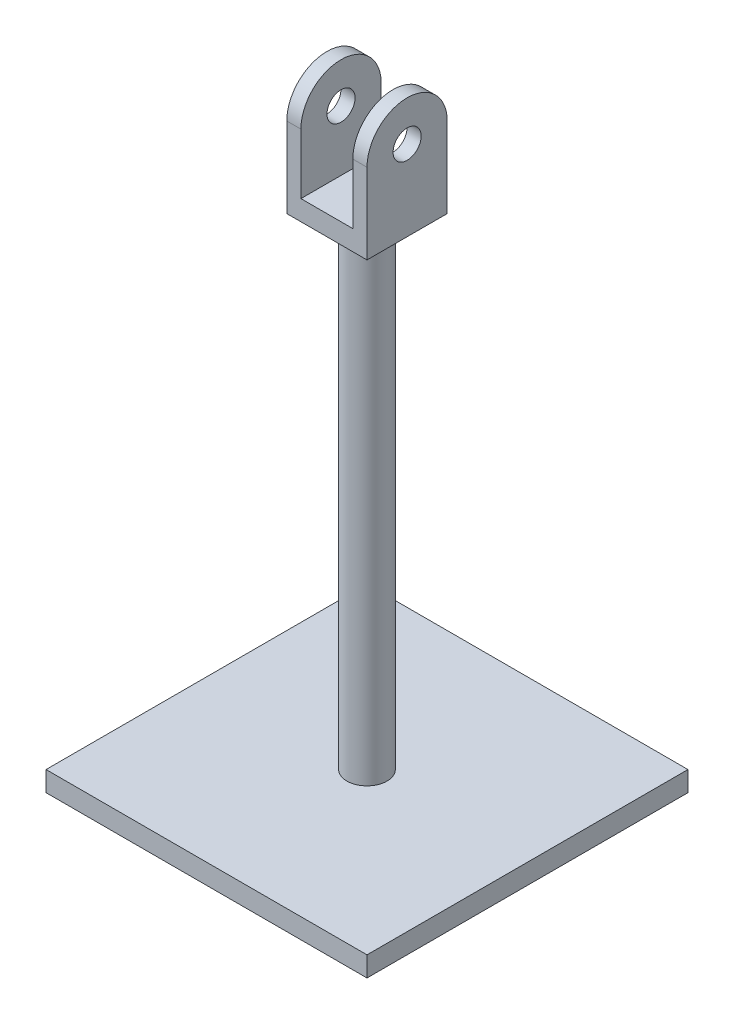
ISO-10303-21;
HEADER;
FILE_DESCRIPTION(('STEP AP214'),'2;1');
FILE_NAME('part.step','',(''),(''),'','','');
FILE_SCHEMA(('AUTOMOTIVE_DESIGN { 1 0 10303 214 1 1 1 1 }'));
ENDSEC;
DATA;
#1=APPLICATION_CONTEXT('core data for automotive mechanical design processes');
#2=APPLICATION_PROTOCOL_DEFINITION('international standard','automotive_design',2000,#1);
#3=PRODUCT_CONTEXT('',#1,'mechanical');
#4=PRODUCT('Part','Part','',(#3));
#5=PRODUCT_RELATED_PRODUCT_CATEGORY('part','',(#4));
#6=PRODUCT_DEFINITION_FORMATION('','',#4);
#7=PRODUCT_DEFINITION_CONTEXT('part definition',#1,'design');
#8=PRODUCT_DEFINITION('design','',#6,#7);
#9=PRODUCT_DEFINITION_SHAPE('','',#8);
#10=(LENGTH_UNIT() NAMED_UNIT(*) SI_UNIT(.MILLI.,.METRE.));
#11=(NAMED_UNIT(*) PLANE_ANGLE_UNIT() SI_UNIT($,.RADIAN.));
#12=(NAMED_UNIT(*) SI_UNIT($,.STERADIAN.) SOLID_ANGLE_UNIT());
#13=UNCERTAINTY_MEASURE_WITH_UNIT(LENGTH_MEASURE(1.E-05),#10,'distance_accuracy_value','');
#14=(GEOMETRIC_REPRESENTATION_CONTEXT(3) GLOBAL_UNCERTAINTY_ASSIGNED_CONTEXT((#13)) GLOBAL_UNIT_ASSIGNED_CONTEXT((#10,
#11,#12)) REPRESENTATION_CONTEXT('',''));
#15=CARTESIAN_POINT('',(0.,0.,0.));
#16=DIRECTION('',(0.,0.,1.));
#17=DIRECTION('',(1.,0.,0.));
#18=AXIS2_PLACEMENT_3D('',#15,#16,#17);
#19=CARTESIAN_POINT('',(10.,145.,0.));
#20=DIRECTION('',(-1.,0.,0.));
#21=DIRECTION('',(0.,0.,1.));
#22=AXIS2_PLACEMENT_3D('',#19,#20,#21);
#23=CYLINDRICAL_SURFACE('',#22,10.);
#24=DIRECTION('',(-1.,0.,0.));
#25=VECTOR('',#24,1.);
#26=CARTESIAN_POINT('',(10.,145.,-10.));
#27=LINE('',#26,#25);
#28=CARTESIAN_POINT('',(10.,145.,-10.));
#29=VERTEX_POINT('',#28);
#30=CARTESIAN_POINT('',(6.47247521819706,145.,-10.));
#31=VERTEX_POINT('',#30);
#32=EDGE_CURVE('E181',#29,#31,#27,.T.);
#33=ORIENTED_EDGE('',*,*,#32,.T.);
#34=CARTESIAN_POINT('',(6.47247521819706,145.,0.));
#35=DIRECTION('',(1.,0.,0.));
#36=DIRECTION('',(0.,0.,-1.));
#37=AXIS2_PLACEMENT_3D('',#34,#35,#36);
#38=CIRCLE('',#37,10.);
#39=CARTESIAN_POINT('',(6.47247521819706,145.,10.));
#40=VERTEX_POINT('',#39);
#41=EDGE_CURVE('E155',#31,#40,#38,.T.);
#42=ORIENTED_EDGE('',*,*,#41,.T.);
#43=DIRECTION('',(-1.,0.,0.));
#44=VECTOR('',#43,1.);
#45=CARTESIAN_POINT('',(10.,145.,10.));
#46=LINE('',#45,#44);
#47=CARTESIAN_POINT('',(10.,145.,10.));
#48=VERTEX_POINT('',#47);
#49=EDGE_CURVE('E178',#48,#40,#46,.T.);
#50=ORIENTED_EDGE('',*,*,#49,.F.);
#51=CARTESIAN_POINT('',(10.,145.,0.));
#52=DIRECTION('',(1.,0.,0.));
#53=DIRECTION('',(0.,0.,-1.));
#54=AXIS2_PLACEMENT_3D('',#51,#52,#53);
#55=CIRCLE('',#54,10.);
#56=EDGE_CURVE('E172',#29,#48,#55,.T.);
#57=ORIENTED_EDGE('',*,*,#56,.F.);
#58=EDGE_LOOP('',(#33,#42,#50,#57));
#59=FACE_BOUND('',#58,.T.);
#60=ADVANCED_FACE('F33',(#59),#23,.T.);
#61=CARTESIAN_POINT('',(10.,145.,0.));
#62=DIRECTION('',(-1.,0.,0.));
#63=DIRECTION('',(0.,0.,1.));
#64=AXIS2_PLACEMENT_3D('',#61,#62,#63);
#65=CYLINDRICAL_SURFACE('',#64,3.5);
#66=CARTESIAN_POINT('',(6.47247521819706,145.,0.));
#67=DIRECTION('',(1.,0.,0.));
#68=DIRECTION('',(0.,0.,-1.));
#69=AXIS2_PLACEMENT_3D('',#66,#67,#68);
#70=CIRCLE('',#69,3.5);
#71=CARTESIAN_POINT('',(6.47247521819706,145.,-3.5));
#72=VERTEX_POINT('',#71);
#73=EDGE_CURVE('E152',#72,#72,#70,.T.);
#74=ORIENTED_EDGE('',*,*,#73,.F.);
#75=EDGE_LOOP('',(#74));
#76=FACE_BOUND('',#75,.T.);
#77=CARTESIAN_POINT('',(10.,145.,0.));
#78=DIRECTION('',(1.,0.,0.));
#79=DIRECTION('',(0.,0.,-1.));
#80=AXIS2_PLACEMENT_3D('',#77,#78,#79);
#81=CIRCLE('',#80,3.5);
#82=CARTESIAN_POINT('',(10.,145.,-3.5));
#83=VERTEX_POINT('',#82);
#84=EDGE_CURVE('E166',#83,#83,#81,.T.);
#85=ORIENTED_EDGE('',*,*,#84,.T.);
#86=EDGE_LOOP('',(#85));
#87=FACE_BOUND('',#86,.T.);
#88=ADVANCED_FACE('F272',(#76,#87),#65,.F.);
#89=CARTESIAN_POINT('',(0.,5.,0.));
#90=DIRECTION('',(0.,1.,0.));
#91=DIRECTION('',(0.,0.,1.));
#92=AXIS2_PLACEMENT_3D('',#89,#90,#91);
#93=PLANE('',#92);
#94=DIRECTION('',(0.,0.,-1.));
#95=VECTOR('',#94,1.);
#96=CARTESIAN_POINT('',(40.,5.,-40.));
#97=LINE('',#96,#95);
#98=CARTESIAN_POINT('',(40.,5.,40.));
#99=VERTEX_POINT('',#98);
#100=CARTESIAN_POINT('',(40.,5.,-40.));
#101=VERTEX_POINT('',#100);
#102=EDGE_CURVE('E212',#99,#101,#97,.T.);
#103=ORIENTED_EDGE('',*,*,#102,.T.);
#104=DIRECTION('',(-1.,0.,0.));
#105=VECTOR('',#104,1.);
#106=CARTESIAN_POINT('',(-40.,5.,-40.));
#107=LINE('',#106,#105);
#108=CARTESIAN_POINT('',(-40.,5.,-40.));
#109=VERTEX_POINT('',#108);
#110=EDGE_CURVE('E86',#101,#109,#107,.T.);
#111=ORIENTED_EDGE('',*,*,#110,.T.);
#112=DIRECTION('',(0.,0.,1.));
#113=VECTOR('',#112,1.);
#114=CARTESIAN_POINT('',(-40.,5.,-40.));
#115=LINE('',#114,#113);
#116=CARTESIAN_POINT('',(-40.,5.,40.));
#117=VERTEX_POINT('',#116);
#118=EDGE_CURVE('E215',#109,#117,#115,.T.);
#119=ORIENTED_EDGE('',*,*,#118,.T.);
#120=DIRECTION('',(1.,0.,0.));
#121=VECTOR('',#120,1.);
#122=CARTESIAN_POINT('',(-40.,5.,40.));
#123=LINE('',#122,#121);
#124=EDGE_CURVE('E57',#117,#99,#123,.T.);
#125=ORIENTED_EDGE('',*,*,#124,.T.);
#126=EDGE_LOOP('',(#103,#111,#119,#125));
#127=FACE_BOUND('',#126,.T.);
#128=CARTESIAN_POINT('',(0.,5.,0.));
#129=DIRECTION('',(0.,1.,0.));
#130=DIRECTION('',(0.,0.,1.));
#131=AXIS2_PLACEMENT_3D('',#128,#129,#130);
#132=CIRCLE('',#131,5.);
#133=CARTESIAN_POINT('',(0.,5.,5.));
#134=VERTEX_POINT('',#133);
#135=EDGE_CURVE('E205',#134,#134,#132,.T.);
#136=ORIENTED_EDGE('',*,*,#135,.F.);
#137=EDGE_LOOP('',(#136));
#138=FACE_BOUND('',#137,.T.);
#139=ADVANCED_FACE('F280',(#127,#138),#93,.T.);
#140=CARTESIAN_POINT('',(40.,5.,-40.));
#141=DIRECTION('',(-1.,0.,0.));
#142=DIRECTION('',(0.,0.,1.));
#143=AXIS2_PLACEMENT_3D('',#140,#141,#142);
#144=PLANE('',#143);
#145=DIRECTION('',(0.,0.,-1.));
#146=VECTOR('',#145,1.);
#147=CARTESIAN_POINT('',(40.,0.,-40.));
#148=LINE('',#147,#146);
#149=CARTESIAN_POINT('',(40.,0.,40.));
#150=VERTEX_POINT('',#149);
#151=CARTESIAN_POINT('',(40.,0.,-40.));
#152=VERTEX_POINT('',#151);
#153=EDGE_CURVE('E209',#150,#152,#148,.T.);
#154=ORIENTED_EDGE('',*,*,#153,.T.);
#155=DIRECTION('',(0.,-1.,0.));
#156=VECTOR('',#155,1.);
#157=CARTESIAN_POINT('',(40.,5.,-40.));
#158=LINE('',#157,#156);
#159=EDGE_CURVE('E41',#101,#152,#158,.T.);
#160=ORIENTED_EDGE('',*,*,#159,.F.);
#161=ORIENTED_EDGE('',*,*,#102,.F.);
#162=DIRECTION('',(0.,-1.,0.));
#163=VECTOR('',#162,1.);
#164=CARTESIAN_POINT('',(40.,5.,40.));
#165=LINE('',#164,#163);
#166=EDGE_CURVE('E218',#99,#150,#165,.T.);
#167=ORIENTED_EDGE('',*,*,#166,.T.);
#168=EDGE_LOOP('',(#154,#160,#161,#167));
#169=FACE_BOUND('',#168,.T.);
#170=ADVANCED_FACE('F35',(#169),#144,.F.);
#171=CARTESIAN_POINT('',(-40.,5.,-40.));
#172=DIRECTION('',(0.,0.,1.));
#173=DIRECTION('',(1.,0.,0.));
#174=AXIS2_PLACEMENT_3D('',#171,#172,#173);
#175=PLANE('',#174);
#176=DIRECTION('',(-1.,0.,0.));
#177=VECTOR('',#176,1.);
#178=CARTESIAN_POINT('',(-40.,0.,-40.));
#179=LINE('',#178,#177);
#180=CARTESIAN_POINT('',(-40.,0.,-40.));
#181=VERTEX_POINT('',#180);
#182=EDGE_CURVE('E221',#152,#181,#179,.T.);
#183=ORIENTED_EDGE('',*,*,#182,.T.);
#184=DIRECTION('',(0.,-1.,0.));
#185=VECTOR('',#184,1.);
#186=CARTESIAN_POINT('',(-40.,5.,-40.));
#187=LINE('',#186,#185);
#188=EDGE_CURVE('E229',#109,#181,#187,.T.);
#189=ORIENTED_EDGE('',*,*,#188,.F.);
#190=ORIENTED_EDGE('',*,*,#110,.F.);
#191=ORIENTED_EDGE('',*,*,#159,.T.);
#192=EDGE_LOOP('',(#183,#189,#190,#191));
#193=FACE_BOUND('',#192,.T.);
#194=ADVANCED_FACE('F417',(#193),#175,.F.);
#195=CARTESIAN_POINT('',(-40.,5.,-40.));
#196=DIRECTION('',(1.,0.,0.));
#197=DIRECTION('',(0.,0.,-1.));
#198=AXIS2_PLACEMENT_3D('',#195,#196,#197);
#199=PLANE('',#198);
#200=DIRECTION('',(0.,0.,1.));
#201=VECTOR('',#200,1.);
#202=CARTESIAN_POINT('',(-40.,0.,-40.));
#203=LINE('',#202,#201);
#204=CARTESIAN_POINT('',(-40.,0.,40.));
#205=VERTEX_POINT('',#204);
#206=EDGE_CURVE('E223',#181,#205,#203,.T.);
#207=ORIENTED_EDGE('',*,*,#206,.T.);
#208=DIRECTION('',(0.,-1.,0.));
#209=VECTOR('',#208,1.);
#210=CARTESIAN_POINT('',(-40.,5.,40.));
#211=LINE('',#210,#209);
#212=EDGE_CURVE('E227',#117,#205,#211,.T.);
#213=ORIENTED_EDGE('',*,*,#212,.F.);
#214=ORIENTED_EDGE('',*,*,#118,.F.);
#215=ORIENTED_EDGE('',*,*,#188,.T.);
#216=EDGE_LOOP('',(#207,#213,#214,#215));
#217=FACE_BOUND('',#216,.T.);
#218=ADVANCED_FACE('F408',(#217),#199,.F.);
#219=CARTESIAN_POINT('',(-40.,5.,40.));
#220=DIRECTION('',(0.,0.,-1.));
#221=DIRECTION('',(-1.,0.,0.));
#222=AXIS2_PLACEMENT_3D('',#219,#220,#221);
#223=PLANE('',#222);
#224=DIRECTION('',(1.,0.,0.));
#225=VECTOR('',#224,1.);
#226=CARTESIAN_POINT('',(-40.,0.,40.));
#227=LINE('',#226,#225);
#228=EDGE_CURVE('E78',#205,#150,#227,.T.);
#229=ORIENTED_EDGE('',*,*,#228,.T.);
#230=ORIENTED_EDGE('',*,*,#166,.F.);
#231=ORIENTED_EDGE('',*,*,#124,.F.);
#232=ORIENTED_EDGE('',*,*,#212,.T.);
#233=EDGE_LOOP('',(#229,#230,#231,#232));
#234=FACE_BOUND('',#233,.T.);
#235=ADVANCED_FACE('F398',(#234),#223,.F.);
#236=CARTESIAN_POINT('',(0.,0.,0.));
#237=DIRECTION('',(0.,1.,0.));
#238=DIRECTION('',(0.,0.,1.));
#239=AXIS2_PLACEMENT_3D('',#236,#237,#238);
#240=PLANE('',#239);
#241=ORIENTED_EDGE('',*,*,#153,.F.);
#242=ORIENTED_EDGE('',*,*,#228,.F.);
#243=ORIENTED_EDGE('',*,*,#206,.F.);
#244=ORIENTED_EDGE('',*,*,#182,.F.);
#245=EDGE_LOOP('',(#241,#242,#243,#244));
#246=FACE_BOUND('',#245,.T.);
#247=ADVANCED_FACE('F381',(#246),#240,.F.);
#248=CARTESIAN_POINT('',(0.,125.,0.));
#249=DIRECTION('',(0.,-1.,0.));
#250=DIRECTION('',(0.,0.,-1.));
#251=AXIS2_PLACEMENT_3D('',#248,#249,#250);
#252=CYLINDRICAL_SURFACE('',#251,5.);
#253=CARTESIAN_POINT('',(0.,125.,0.));
#254=DIRECTION('',(0.,1.,0.));
#255=DIRECTION('',(0.,0.,1.));
#256=AXIS2_PLACEMENT_3D('',#253,#254,#255);
#257=CIRCLE('',#256,5.);
#258=CARTESIAN_POINT('',(0.,125.,5.));
#259=VERTEX_POINT('',#258);
#260=EDGE_CURVE('E206',#259,#259,#257,.T.);
#261=ORIENTED_EDGE('',*,*,#260,.F.);
#262=EDGE_LOOP('',(#261));
#263=FACE_BOUND('',#262,.T.);
#264=ORIENTED_EDGE('',*,*,#135,.T.);
#265=EDGE_LOOP('',(#264));
#266=FACE_BOUND('',#265,.T.);
#267=ADVANCED_FACE('F373',(#263,#266),#252,.T.);
#268=CARTESIAN_POINT('',(0.,125.,0.));
#269=DIRECTION('',(0.,1.,0.));
#270=DIRECTION('',(0.,0.,1.));
#271=AXIS2_PLACEMENT_3D('',#268,#269,#270);
#272=PLANE('',#271);
#273=DIRECTION('',(0.,0.,-1.));
#274=VECTOR('',#273,1.);
#275=CARTESIAN_POINT('',(10.,125.,-10.));
#276=LINE('',#275,#274);
#277=CARTESIAN_POINT('',(10.,125.,10.));
#278=VERTEX_POINT('',#277);
#279=CARTESIAN_POINT('',(10.,125.,-10.));
#280=VERTEX_POINT('',#279);
#281=EDGE_CURVE('E184',#278,#280,#276,.T.);
#282=ORIENTED_EDGE('',*,*,#281,.F.);
#283=DIRECTION('',(1.,0.,0.));
#284=VECTOR('',#283,1.);
#285=CARTESIAN_POINT('',(-10.,125.,10.));
#286=LINE('',#285,#284);
#287=CARTESIAN_POINT('',(-10.,125.,10.));
#288=VERTEX_POINT('',#287);
#289=EDGE_CURVE('E191',#288,#278,#286,.T.);
#290=ORIENTED_EDGE('',*,*,#289,.F.);
#291=DIRECTION('',(0.,0.,1.));
#292=VECTOR('',#291,1.);
#293=CARTESIAN_POINT('',(-10.,125.,-10.));
#294=LINE('',#293,#292);
#295=CARTESIAN_POINT('',(-10.,125.,-10.));
#296=VERTEX_POINT('',#295);
#297=EDGE_CURVE('E189',#296,#288,#294,.T.);
#298=ORIENTED_EDGE('',*,*,#297,.F.);
#299=DIRECTION('',(-1.,0.,0.));
#300=VECTOR('',#299,1.);
#301=CARTESIAN_POINT('',(-10.,125.,-10.));
#302=LINE('',#301,#300);
#303=EDGE_CURVE('E187',#280,#296,#302,.T.);
#304=ORIENTED_EDGE('',*,*,#303,.F.);
#305=EDGE_LOOP('',(#282,#290,#298,#304));
#306=FACE_BOUND('',#305,.T.);
#307=ORIENTED_EDGE('',*,*,#260,.T.);
#308=EDGE_LOOP('',(#307));
#309=FACE_BOUND('',#308,.T.);
#310=ADVANCED_FACE('F252',(#306,#309),#272,.F.);
#311=CARTESIAN_POINT('',(10.,130.,-10.));
#312=DIRECTION('',(-1.,0.,0.));
#313=DIRECTION('',(0.,0.,1.));
#314=AXIS2_PLACEMENT_3D('',#311,#312,#313);
#315=PLANE('',#314);
#316=ORIENTED_EDGE('',*,*,#281,.T.);
#317=DIRECTION('',(0.,-1.,0.));
#318=VECTOR('',#317,1.);
#319=CARTESIAN_POINT('',(10.,130.,-10.));
#320=LINE('',#319,#318);
#321=EDGE_CURVE('E202',#29,#280,#320,.T.);
#322=ORIENTED_EDGE('',*,*,#321,.F.);
#323=ORIENTED_EDGE('',*,*,#56,.T.);
#324=DIRECTION('',(0.,-1.,0.));
#325=VECTOR('',#324,1.);
#326=CARTESIAN_POINT('',(10.,130.,10.));
#327=LINE('',#326,#325);
#328=EDGE_CURVE('E193',#48,#278,#327,.T.);
#329=ORIENTED_EDGE('',*,*,#328,.T.);
#330=EDGE_LOOP('',(#316,#322,#323,#329));
#331=FACE_BOUND('',#330,.T.);
#332=ORIENTED_EDGE('',*,*,#84,.F.);
#333=EDGE_LOOP('',(#332));
#334=FACE_BOUND('',#333,.T.);
#335=ADVANCED_FACE('F248',(#331,#334),#315,.F.);
#336=CARTESIAN_POINT('',(-10.,130.,-10.));
#337=DIRECTION('',(0.,0.,1.));
#338=DIRECTION('',(1.,0.,0.));
#339=AXIS2_PLACEMENT_3D('',#336,#337,#338);
#340=PLANE('',#339);
#341=DIRECTION('',(1.,0.,0.));
#342=VECTOR('',#341,1.);
#343=CARTESIAN_POINT('',(-10.,130.,-10.));
#344=LINE('',#343,#342);
#345=CARTESIAN_POINT('',(-6.47247521819706,130.,-10.));
#346=VERTEX_POINT('',#345);
#347=CARTESIAN_POINT('',(6.47247521819706,130.,-10.));
#348=VERTEX_POINT('',#347);
#349=EDGE_CURVE('E134',#346,#348,#344,.T.);
#350=ORIENTED_EDGE('',*,*,#349,.T.);
#351=DIRECTION('',(0.,1.,0.));
#352=VECTOR('',#351,1.);
#353=CARTESIAN_POINT('',(6.47247521819706,130.,-10.));
#354=LINE('',#353,#352);
#355=EDGE_CURVE('E142',#348,#31,#354,.T.);
#356=ORIENTED_EDGE('',*,*,#355,.T.);
#357=ORIENTED_EDGE('',*,*,#32,.F.);
#358=ORIENTED_EDGE('',*,*,#321,.T.);
#359=ORIENTED_EDGE('',*,*,#303,.T.);
#360=DIRECTION('',(0.,-1.,0.));
#361=VECTOR('',#360,1.);
#362=CARTESIAN_POINT('',(-10.,130.,-10.));
#363=LINE('',#362,#361);
#364=CARTESIAN_POINT('',(-10.,145.,-10.));
#365=VERTEX_POINT('',#364);
#366=EDGE_CURVE('E199',#365,#296,#363,.T.);
#367=ORIENTED_EDGE('',*,*,#366,.F.);
#368=CARTESIAN_POINT('',(-6.47247521819706,145.,-10.));
#369=VERTEX_POINT('',#368);
#370=EDGE_CURVE('E151',#369,#365,#27,.T.);
#371=ORIENTED_EDGE('',*,*,#370,.F.);
#372=DIRECTION('',(0.,-1.,0.));
#373=VECTOR('',#372,1.);
#374=CARTESIAN_POINT('',(-6.47247521819706,130.,-10.));
#375=LINE('',#374,#373);
#376=EDGE_CURVE('E48',#369,#346,#375,.T.);
#377=ORIENTED_EDGE('',*,*,#376,.T.);
#378=EDGE_LOOP('',(#350,#356,#357,#358,#359,#367,#371,#377));
#379=FACE_BOUND('',#378,.T.);
#380=ADVANCED_FACE('F149',(#379),#340,.F.);
#381=CARTESIAN_POINT('',(-10.,130.,-10.));
#382=DIRECTION('',(1.,0.,0.));
#383=DIRECTION('',(0.,0.,-1.));
#384=AXIS2_PLACEMENT_3D('',#381,#382,#383);
#385=PLANE('',#384);
#386=ORIENTED_EDGE('',*,*,#297,.T.);
#387=DIRECTION('',(0.,-1.,0.));
#388=VECTOR('',#387,1.);
#389=CARTESIAN_POINT('',(-10.,130.,10.));
#390=LINE('',#389,#388);
#391=CARTESIAN_POINT('',(-10.,145.,10.));
#392=VERTEX_POINT('',#391);
#393=EDGE_CURVE('E196',#392,#288,#390,.T.);
#394=ORIENTED_EDGE('',*,*,#393,.F.);
#395=CARTESIAN_POINT('',(-10.,145.,0.));
#396=DIRECTION('',(1.,0.,0.));
#397=DIRECTION('',(0.,0.,-1.));
#398=AXIS2_PLACEMENT_3D('',#395,#396,#397);
#399=CIRCLE('',#398,10.);
#400=EDGE_CURVE('E169',#365,#392,#399,.T.);
#401=ORIENTED_EDGE('',*,*,#400,.F.);
#402=ORIENTED_EDGE('',*,*,#366,.T.);
#403=EDGE_LOOP('',(#386,#394,#401,#402));
#404=FACE_BOUND('',#403,.T.);
#405=CARTESIAN_POINT('',(-10.,145.,0.));
#406=DIRECTION('',(1.,0.,0.));
#407=DIRECTION('',(0.,0.,-1.));
#408=AXIS2_PLACEMENT_3D('',#405,#406,#407);
#409=CIRCLE('',#408,3.5);
#410=CARTESIAN_POINT('',(-10.,145.,-3.5));
#411=VERTEX_POINT('',#410);
#412=EDGE_CURVE('E141',#411,#411,#409,.T.);
#413=ORIENTED_EDGE('',*,*,#412,.T.);
#414=EDGE_LOOP('',(#413));
#415=FACE_BOUND('',#414,.T.);
#416=ADVANCED_FACE('F257',(#404,#415),#385,.F.);
#417=CARTESIAN_POINT('',(-10.,130.,10.));
#418=DIRECTION('',(0.,0.,-1.));
#419=DIRECTION('',(-1.,0.,0.));
#420=AXIS2_PLACEMENT_3D('',#417,#418,#419);
#421=PLANE('',#420);
#422=ORIENTED_EDGE('',*,*,#49,.T.);
#423=DIRECTION('',(0.,-1.,0.));
#424=VECTOR('',#423,1.);
#425=CARTESIAN_POINT('',(6.47247521819707,130.,10.));
#426=LINE('',#425,#424);
#427=CARTESIAN_POINT('',(6.47247521819706,130.,9.99999999999999));
#428=VERTEX_POINT('',#427);
#429=EDGE_CURVE('E162',#40,#428,#426,.T.);
#430=ORIENTED_EDGE('',*,*,#429,.T.);
#431=DIRECTION('',(-1.,0.,0.));
#432=VECTOR('',#431,1.);
#433=CARTESIAN_POINT('',(-10.,130.,10.));
#434=LINE('',#433,#432);
#435=CARTESIAN_POINT('',(-6.47247521819706,130.,9.99999999999999));
#436=VERTEX_POINT('',#435);
#437=EDGE_CURVE('E11',#428,#436,#434,.T.);
#438=ORIENTED_EDGE('',*,*,#437,.T.);
#439=DIRECTION('',(0.,1.,0.));
#440=VECTOR('',#439,1.);
#441=CARTESIAN_POINT('',(-6.47247521819706,130.,10.));
#442=LINE('',#441,#440);
#443=CARTESIAN_POINT('',(-6.47247521819706,145.,10.));
#444=VERTEX_POINT('',#443);
#445=EDGE_CURVE('E146',#436,#444,#442,.T.);
#446=ORIENTED_EDGE('',*,*,#445,.T.);
#447=EDGE_CURVE('E175',#444,#392,#46,.T.);
#448=ORIENTED_EDGE('',*,*,#447,.T.);
#449=ORIENTED_EDGE('',*,*,#393,.T.);
#450=ORIENTED_EDGE('',*,*,#289,.T.);
#451=ORIENTED_EDGE('',*,*,#328,.F.);
#452=EDGE_LOOP('',(#422,#430,#438,#446,#448,#449,#450,#451));
#453=FACE_BOUND('',#452,.T.);
#454=ADVANCED_FACE('F241',(#453),#421,.F.);
#455=ORIENTED_EDGE('',*,*,#447,.F.);
#456=CARTESIAN_POINT('',(-6.47247521819706,145.,0.));
#457=DIRECTION('',(-1.,0.,0.));
#458=DIRECTION('',(0.,0.,1.));
#459=AXIS2_PLACEMENT_3D('',#456,#457,#458);
#460=CIRCLE('',#459,10.);
#461=EDGE_CURVE('E156',#444,#369,#460,.T.);
#462=ORIENTED_EDGE('',*,*,#461,.T.);
#463=ORIENTED_EDGE('',*,*,#370,.T.);
#464=ORIENTED_EDGE('',*,*,#400,.T.);
#465=EDGE_LOOP('',(#455,#462,#463,#464));
#466=FACE_BOUND('',#465,.T.);
#467=ADVANCED_FACE('F262',(#466),#23,.T.);
#468=CARTESIAN_POINT('',(-6.47247521819706,145.,0.));
#469=DIRECTION('',(-1.,0.,0.));
#470=DIRECTION('',(0.,0.,1.));
#471=AXIS2_PLACEMENT_3D('',#468,#469,#470);
#472=CIRCLE('',#471,3.5);
#473=CARTESIAN_POINT('',(-6.47247521819706,145.,3.5));
#474=VERTEX_POINT('',#473);
#475=EDGE_CURVE('E233',#474,#474,#472,.T.);
#476=ORIENTED_EDGE('',*,*,#475,.F.);
#477=EDGE_LOOP('',(#476));
#478=FACE_BOUND('',#477,.T.);
#479=ORIENTED_EDGE('',*,*,#412,.F.);
#480=EDGE_LOOP('',(#479));
#481=FACE_BOUND('',#480,.T.);
#482=ADVANCED_FACE('F264',(#478,#481),#65,.F.);
#483=CARTESIAN_POINT('',(-6.47247521819706,130.,-20.));
#484=DIRECTION('',(0.,-1.,0.));
#485=DIRECTION('',(0.,0.,-1.));
#486=AXIS2_PLACEMENT_3D('',#483,#484,#485);
#487=PLANE('',#486);
#488=DIRECTION('',(0.,0.,1.));
#489=VECTOR('',#488,1.);
#490=CARTESIAN_POINT('',(-6.47247521819706,130.,-20.));
#491=LINE('',#490,#489);
#492=EDGE_CURVE('E136',#346,#436,#491,.T.);
#493=ORIENTED_EDGE('',*,*,#492,.T.);
#494=ORIENTED_EDGE('',*,*,#437,.F.);
#495=DIRECTION('',(0.,0.,1.));
#496=VECTOR('',#495,1.);
#497=CARTESIAN_POINT('',(6.47247521819706,130.,-20.));
#498=LINE('',#497,#496);
#499=EDGE_CURVE('E138',#348,#428,#498,.T.);
#500=ORIENTED_EDGE('',*,*,#499,.F.);
#501=ORIENTED_EDGE('',*,*,#349,.F.);
#502=EDGE_LOOP('',(#493,#494,#500,#501));
#503=FACE_BOUND('',#502,.T.);
#504=ADVANCED_FACE('F135',(#503),#487,.F.);
#505=CARTESIAN_POINT('',(6.47247521819706,180.,-20.));
#506=DIRECTION('',(1.,0.,0.));
#507=DIRECTION('',(0.,0.,-1.));
#508=AXIS2_PLACEMENT_3D('',#505,#506,#507);
#509=PLANE('',#508);
#510=ORIENTED_EDGE('',*,*,#73,.T.);
#511=EDGE_LOOP('',(#510));
#512=FACE_BOUND('',#511,.T.);
#513=ORIENTED_EDGE('',*,*,#499,.T.);
#514=ORIENTED_EDGE('',*,*,#429,.F.);
#515=ORIENTED_EDGE('',*,*,#41,.F.);
#516=ORIENTED_EDGE('',*,*,#355,.F.);
#517=EDGE_LOOP('',(#513,#514,#515,#516));
#518=FACE_BOUND('',#517,.T.);
#519=ADVANCED_FACE('F239',(#512,#518),#509,.F.);
#520=CARTESIAN_POINT('',(-6.47247521819706,180.,-20.));
#521=DIRECTION('',(-1.,0.,0.));
#522=DIRECTION('',(0.,0.,1.));
#523=AXIS2_PLACEMENT_3D('',#520,#521,#522);
#524=PLANE('',#523);
#525=ORIENTED_EDGE('',*,*,#475,.T.);
#526=EDGE_LOOP('',(#525));
#527=FACE_BOUND('',#526,.T.);
#528=ORIENTED_EDGE('',*,*,#461,.F.);
#529=ORIENTED_EDGE('',*,*,#445,.F.);
#530=ORIENTED_EDGE('',*,*,#492,.F.);
#531=ORIENTED_EDGE('',*,*,#376,.F.);
#532=EDGE_LOOP('',(#528,#529,#530,#531));
#533=FACE_BOUND('',#532,.T.);
#534=ADVANCED_FACE('F144',(#527,#533),#524,.F.);
#535=CLOSED_SHELL('',(#60,#88,#139,#170,#194,#218,#235,#247,#267,#310,#335,#380,#416,#454,#467,
#482,#504,#519,#534));
#536=MANIFOLD_SOLID_BREP('B2',#535);
#537=ADVANCED_BREP_SHAPE_REPRESENTATION('',(#18,#536),#14);
#538=SHAPE_DEFINITION_REPRESENTATION(#9,#537);
ENDSEC;
END-ISO-10303-21;
